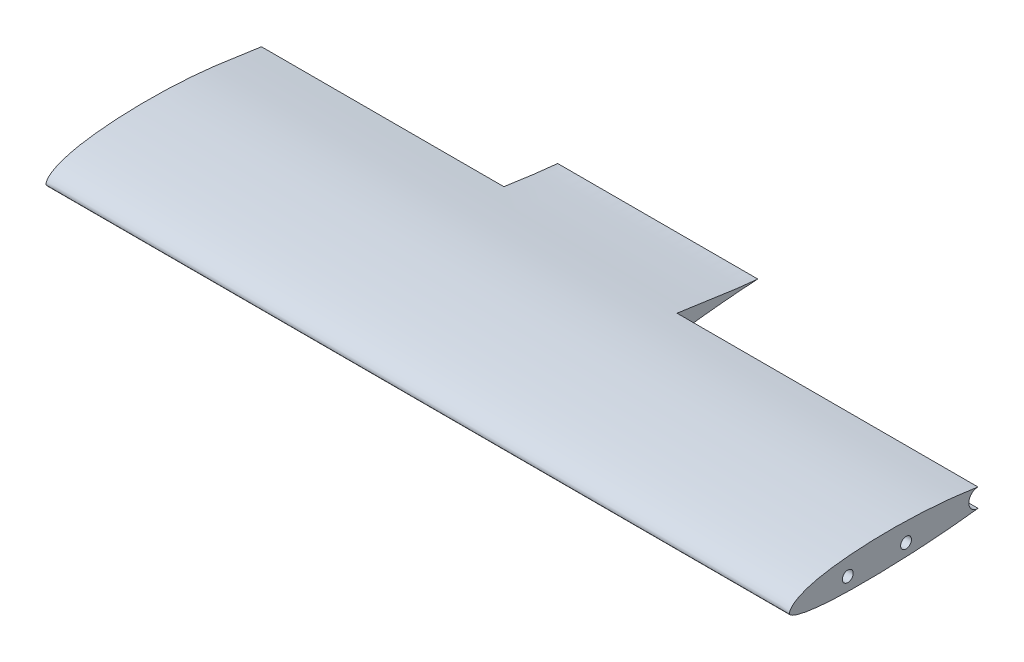
ISO-10303-21;
HEADER;
FILE_DESCRIPTION(('STEP AP214'),'2;1');
FILE_NAME('part.step','',(''),(''),'','','');
FILE_SCHEMA(('AUTOMOTIVE_DESIGN { 1 0 10303 214 1 1 1 1 }'));
ENDSEC;
DATA;
#1=APPLICATION_CONTEXT('core data for automotive mechanical design processes');
#2=APPLICATION_PROTOCOL_DEFINITION('international standard','automotive_design',2000,#1);
#3=PRODUCT_CONTEXT('',#1,'mechanical');
#4=PRODUCT('Part','Part','',(#3));
#5=PRODUCT_RELATED_PRODUCT_CATEGORY('part','',(#4));
#6=PRODUCT_DEFINITION_FORMATION('','',#4);
#7=PRODUCT_DEFINITION_CONTEXT('part definition',#1,'design');
#8=PRODUCT_DEFINITION('design','',#6,#7);
#9=PRODUCT_DEFINITION_SHAPE('','',#8);
#10=(LENGTH_UNIT() NAMED_UNIT(*) SI_UNIT(.MILLI.,.METRE.));
#11=(NAMED_UNIT(*) PLANE_ANGLE_UNIT() SI_UNIT($,.RADIAN.));
#12=(NAMED_UNIT(*) SI_UNIT($,.STERADIAN.) SOLID_ANGLE_UNIT());
#13=UNCERTAINTY_MEASURE_WITH_UNIT(LENGTH_MEASURE(1.E-05),#10,'distance_accuracy_value','');
#14=(GEOMETRIC_REPRESENTATION_CONTEXT(3) GLOBAL_UNCERTAINTY_ASSIGNED_CONTEXT((#13)) GLOBAL_UNIT_ASSIGNED_CONTEXT((#10,
#11,#12)) REPRESENTATION_CONTEXT('',''));
#15=CARTESIAN_POINT('',(0.,0.,0.));
#16=DIRECTION('',(0.,0.,1.));
#17=DIRECTION('',(1.,0.,0.));
#18=AXIS2_PLACEMENT_3D('',#15,#16,#17);
#19=CARTESIAN_POINT('',(1040.,4.83997638769715,-346.6));
#20=CARTESIAN_POINT('',(1040.,4.84868294691011,-346.59785213397));
#21=CARTESIAN_POINT('',(1040.,4.93336209756162,-345.166936044504));
#22=CARTESIAN_POINT('',(1040.,5.10700694519278,-343.709836643677));
#23=CARTESIAN_POINT('',(1040.,5.41017075794042,-340.206784132033));
#24=CARTESIAN_POINT('',(1040.,5.85268281466644,-335.905943355972));
#25=CARTESIAN_POINT('',(1040.,6.4722745474185,-330.29031907157));
#26=CARTESIAN_POINT('',(1040.,7.25373437050042,-323.655847310548));
#27=CARTESIAN_POINT('',(1040.,8.22307664941785,-315.997567636551));
#28=CARTESIAN_POINT('',(1040.,9.36156097861068,-307.423222857254));
#29=CARTESIAN_POINT('',(1040.,10.6635037599335,-298.010831034326));
#30=CARTESIAN_POINT('',(1040.,12.1173159709685,-287.854212759161));
#31=CARTESIAN_POINT('',(1040.,13.6988944275419,-277.048408585074));
#32=CARTESIAN_POINT('',(1040.,15.3817883153086,-265.691695949232));
#33=CARTESIAN_POINT('',(1040.,17.1219228948068,-253.881119893573));
#34=CARTESIAN_POINT('',(1040.,18.9007690967919,-241.720308010265));
#35=CARTESIAN_POINT('',(1040.,20.638143833598,-229.308493852932));
#36=CARTESIAN_POINT('',(1040.,22.3157910551663,-216.741551687001));
#37=CARTESIAN_POINT('',(1040.,23.7595433863055,-204.050857632811));
#38=CARTESIAN_POINT('',(1040.,24.9053426433323,-191.257428920763));
#39=CARTESIAN_POINT('',(1040.,25.8572517006955,-178.398255103325));
#40=CARTESIAN_POINT('',(1040.,26.5782085447624,-165.519761570319));
#41=CARTESIAN_POINT('',(1040.,27.0713380866151,-152.694536507981));
#42=CARTESIAN_POINT('',(1040.,27.3617048782736,-139.989981786491));
#43=CARTESIAN_POINT('',(1040.,27.4214259489243,-127.474648660722));
#44=CARTESIAN_POINT('',(1040.,27.2786662067202,-115.21693666225));
#45=CARTESIAN_POINT('',(1040.,26.9174034340255,-103.283909878835));
#46=CARTESIAN_POINT('',(1040.,26.360201212197,-91.7466650302918));
#47=CARTESIAN_POINT('',(1040.,25.602562122874,-80.6691840019192));
#48=CARTESIAN_POINT('',(1040.,24.6662261613144,-70.1181532773865));
#49=CARTESIAN_POINT('',(1040.,23.5415922869784,-60.1571368746462));
#50=CARTESIAN_POINT('',(1040.,22.2483852151924,-50.843546419187));
#51=CARTESIAN_POINT('',(1040.,20.7681558316871,-42.2316784452521));
#52=CARTESIAN_POINT('',(1040.,19.1388977835948,-34.3615830461008));
#53=CARTESIAN_POINT('',(1040.,17.3170359072766,-27.2684076187504));
#54=CARTESIAN_POINT('',(1040.,15.3019620529912,-20.9780333205586));
#55=CARTESIAN_POINT('',(1040.,13.1824606631904,-15.4779938036206));
#56=CARTESIAN_POINT('',(1040.,10.9371691606662,-10.7994149202204));
#57=CARTESIAN_POINT('',(1040.,8.63337766346878,-6.95382679368364));
#58=CARTESIAN_POINT('',(1040.,6.30098718992494,-3.93591898079676));
#59=CARTESIAN_POINT('',(1040.,3.89645227401003,-1.76621965553461));
#60=CARTESIAN_POINT('',(1040.,1.5610546807599,-0.467529411694256));
#61=CARTESIAN_POINT('',(1040.,-0.611861653624535,0.289663119257988));
#62=CARTESIAN_POINT('',(1040.,-2.77906348855156,-0.370650439303011));
#63=CARTESIAN_POINT('',(1040.,-4.21995184765395,-2.48232441391583));
#64=CARTESIAN_POINT('',(1040.,-5.67727699514903,-5.33698465791971));
#65=CARTESIAN_POINT('',(1040.,-7.07739123288437,-9.25198377943141));
#66=CARTESIAN_POINT('',(1040.,-8.39823430199488,-14.1065752398985));
#67=CARTESIAN_POINT('',(1040.,-9.61516954449393,-19.9024318244629));
#68=CARTESIAN_POINT('',(1040.,-10.7010995656754,-26.599345669982));
#69=CARTESIAN_POINT('',(1040.,-11.6537912755739,-34.1645195713889));
#70=CARTESIAN_POINT('',(1040.,-12.4597704216329,-42.5604388567903));
#71=CARTESIAN_POINT('',(1040.,-13.1153519549816,-51.7390191835686));
#72=CARTESIAN_POINT('',(1040.,-13.6251626516985,-61.6504552794448));
#73=CARTESIAN_POINT('',(1040.,-13.9816658713143,-72.2364850835678));
#74=CARTESIAN_POINT('',(1040.,-14.1886964665776,-83.4369290290459));
#75=CARTESIAN_POINT('',(1040.,-14.2450062649441,-95.1838047668361));
#76=CARTESIAN_POINT('',(1040.,-14.156607094396,-107.40667693573));
#77=CARTESIAN_POINT('',(1040.,-13.9277138872244,-120.030586221615));
#78=CARTESIAN_POINT('',(1040.,-13.5623258304755,-132.975867445929));
#79=CARTESIAN_POINT('',(1040.,-13.0683037139574,-146.159637367673));
#80=CARTESIAN_POINT('',(1040.,-12.4378717594453,-159.496107279272));
#81=CARTESIAN_POINT('',(1040.,-11.6818130666688,-172.896412867546));
#82=CARTESIAN_POINT('',(1040.,-10.7518834607499,-186.290828968544));
#83=CARTESIAN_POINT('',(1040.,-9.61892352332749,-199.629097752344));
#84=CARTESIAN_POINT('',(1040.,-8.33578917286104,-212.876622586146));
#85=CARTESIAN_POINT('',(1040.,-6.93958504172576,-225.984173770363));
#86=CARTESIAN_POINT('',(1040.,-5.47533275442785,-238.880374036266));
#87=CARTESIAN_POINT('',(1040.,-4.00845717439935,-251.491480033317));
#88=CARTESIAN_POINT('',(1040.,-2.58431265111658,-263.721696697937));
#89=CARTESIAN_POINT('',(1040.,-1.25971224140681,-275.470578158299));
#90=CARTESIAN_POINT('',(1040.,-0.0540326872204289,-286.627453872095));
#91=CARTESIAN_POINT('',(1040.,1.01236984619496,-297.086149346924));
#92=CARTESIAN_POINT('',(1040.,1.92639151980839,-306.747444526378));
#93=CARTESIAN_POINT('',(1040.,2.68985457896187,-315.513180102047));
#94=CARTESIAN_POINT('',(1040.,3.31662469525845,-323.304392995755));
#95=CARTESIAN_POINT('',(1040.,3.80488062569906,-330.019051028372));
#96=CARTESIAN_POINT('',(1040.,4.19871820912005,-335.688272924819));
#97=CARTESIAN_POINT('',(1040.,4.53103604311106,-340.041103550893));
#98=CARTESIAN_POINT('',(1040.,4.7368187688383,-343.623424741997));
#99=CARTESIAN_POINT('',(1040.,4.84931723782861,-345.114805989598));
#100=CARTESIAN_POINT('',(1040.,4.8310854484679,-346.602193351688));
#101=CARTESIAN_POINT('',(1040.,4.83997638769715,-346.6));
#102=B_SPLINE_CURVE_WITH_KNOTS('',3,(#19,#20,#21,#22,#23,#24,#25,#26,#27,#28,#29,#30,#31,#32,
#33,#34,#35,#36,#37,#38,#39,#40,#41,#42,#43,#44,#45,#46,#47,#48,#49,#50,#51,#52,#53,#54,#55,#56,
#57,#58,#59,#60,#61,#62,#63,#64,#65,#66,#67,#68,#69,#70,#71,#72,#73,#74,#75,#76,#77,#78,#79,#80,
#81,#82,#83,#84,#85,#86,#87,#88,#89,#90,#91,#92,#93,#94,#95,#96,#97,#98,#99,#100,#101),
.UNSPECIFIED.,.T.,.F.,(4,1,1,1,1,1,1,1,1,1,1,1,1,1,1,1,1,1,1,1,1,1,1,1,1,1,1,1,1,1,1,1,1,1,1,1,
1,1,1,1,1,1,1,1,1,1,1,1,1,1,1,1,1,1,1,1,1,1,1,1,1,1,1,1,1,1,1,1,1,1,1,1,1,1,1,1,1,1,1,1,4),(0.,
0.000971237958935089,0.00379550488941406,0.00838889713311412,0.0147108585341679,
0.0226780451151255,0.0321935893654122,0.0431578374772158,0.0554477635765267,0.0689450810748732,
0.0835209743295518,0.0990345049396833,0.115338149300278,0.132292378261073,0.149748787287016,
0.167548160817062,0.185533000847794,0.203606824322396,0.221802152219981,0.240094780419079,
0.258381325545334,0.276593840485898,0.294615696320151,0.312363136598153,0.329758285552068,
0.34668867666744,0.363076304230722,0.378823915995178,0.393853850968574,0.408070676422894,
0.421404123740081,0.433792847882556,0.445184773052429,0.455537591190034,0.464887425285465,
0.473229998593558,0.480557633281548,0.486906623799577,0.492238034051424,0.496718364977629,
0.500526341599145,0.503606091199367,0.506177592628953,0.509478573363382,0.514052138731787,
0.519911011985978,0.527046393100711,0.535434514860353,0.545049400456516,0.555862282514593,
0.56781964692456,0.58087606000333,0.594950040868561,0.609977749598367,0.625870112949949,
0.642537246695213,0.659878939874303,0.677794441934522,0.696172799529494,0.714892973853184,
0.733838964579521,0.752890035469179,0.771908418749841,0.790874705845988,0.809754599599678,
0.828447710464764,0.846871330730811,0.864890849052298,0.882382263972322,0.89917761398861,
0.915117479075331,0.930053399369896,0.943838005379903,0.956340240690094,0.967439356026097,
0.977019226998307,0.985009700423928,0.991382470548144,0.996091139759218,0.999008193999625,1.),.UNSPECIFIED.);
#103=DIRECTION('',(-1.,0.,0.));
#104=VECTOR('',#103,1.);
#105=SURFACE_OF_LINEAR_EXTRUSION('',#102,#104);
#106=CARTESIAN_POINT('',(-470.4,18.7617372690907,-242.6));
#107=CARTESIAN_POINT('',(-470.4,18.4861754169665,-244.519503118179));
#108=CARTESIAN_POINT('',(-470.4,18.2080068766833,-246.438627718452));
#109=CARTESIAN_POINT('',(-470.4,17.648596991396,-250.276433454266));
#110=CARTESIAN_POINT('',(-470.4,17.3673556403513,-252.195114588928));
#111=CARTESIAN_POINT('',(-470.4,16.8039420848592,-256.032337516827));
#112=CARTESIAN_POINT('',(-470.4,16.5217698813349,-257.950879310199));
#113=CARTESIAN_POINT('',(-470.4,15.956553905387,-261.787832596597));
#114=CARTESIAN_POINT('',(-470.4,15.6735101339023,-263.70624408976));
#115=CARTESIAN_POINT('',(-470.4,15.1066113626237,-267.542946852838));
#116=CARTESIAN_POINT('',(-470.4,14.8227563629235,-269.461238122766));
#117=CARTESIAN_POINT('',(-470.4,14.2554931900897,-273.297889204433));
#118=CARTESIAN_POINT('',(-470.4,13.9720850174958,-275.216249016253));
#119=CARTESIAN_POINT('',(-470.4,13.4070236766433,-279.0532302451));
#120=CARTESIAN_POINT('',(-470.4,13.1253705109116,-280.9718516625));
#121=CARTESIAN_POINT('',(-470.4,12.5646409947528,-284.809463002019));
#122=CARTESIAN_POINT('',(-470.4,12.28556463337,-286.728452922536));
#123=CARTESIAN_POINT('',(-470.4,11.7308268937594,-290.566920890903));
#124=CARTESIAN_POINT('',(-470.4,11.4551655050206,-292.486398937231));
#125=CARTESIAN_POINT('',(-470.4,10.90842201053,-296.326048849765));
#126=CARTESIAN_POINT('',(-470.4,10.6373400002637,-298.246220729586));
#127=CARTESIAN_POINT('',(-470.4,10.1008000727563,-302.087337642931));
#128=CARTESIAN_POINT('',(-470.4,9.83534211744316,-304.00828267113));
#129=CARTESIAN_POINT('',(-470.4,9.31086706888201,-307.850882309116));
#130=CARTESIAN_POINT('',(-470.4,9.05184941609702,-309.772536842436));
#131=CARTESIAN_POINT('',(-470.4,8.54112247659432,-313.617221031497));
#132=CARTESIAN_POINT('',(-470.4,8.28941470880274,-315.540250889156));
#133=CARTESIAN_POINT('',(-470.4,7.79483429429874,-319.387285958403));
#134=CARTESIAN_POINT('',(-470.4,7.55196089855657,-321.311291073211));
#135=CARTESIAN_POINT('',(-470.4,7.07958752750583,-325.159491374509));
#136=CARTESIAN_POINT('',(-470.4,6.8500777010983,-327.083685346183));
#137=CARTESIAN_POINT('',(-470.4,6.51544027130188,-329.974631467041));
#138=CARTESIAN_POINT('',(-470.4,6.40530863459935,-330.940807368128));
#139=CARTESIAN_POINT('',(-470.4,6.18869979990306,-332.872467920463));
#140=CARTESIAN_POINT('',(-470.4,6.08221862691694,-333.837952125187));
#141=CARTESIAN_POINT('',(-470.4,5.87395074932842,-335.757575106809));
#142=CARTESIAN_POINT('',(-470.4,5.77212276224222,-336.711709411678));
#143=CARTESIAN_POINT('',(-470.4,5.57354362518302,-338.635776634387));
#144=CARTESIAN_POINT('',(-470.4,5.47689824353089,-339.605720748241));
#145=CARTESIAN_POINT('',(-470.4,5.3391649176087,-341.079890314043));
#146=CARTESIAN_POINT('',(-470.4,5.29371455941509,-341.583709942369));
#147=CARTESIAN_POINT('',(-470.4,5.2253657201099,-342.33290160343));
#148=CARTESIAN_POINT('',(-470.4,5.20285534236857,-342.578309502865));
#149=CARTESIAN_POINT('',(-470.4,5.15815293241496,-343.056282380408));
#150=CARTESIAN_POINT('',(-470.4,5.13600523407568,-343.28885148347));
#151=CARTESIAN_POINT('',(-470.4,5.10230592286108,-343.630833723333));
#152=CARTESIAN_POINT('',(-470.4,5.09134786647534,-343.740303926589));
#153=CARTESIAN_POINT('',(-470.4,5.06937916918066,-343.954110375556));
#154=CARTESIAN_POINT('',(-470.4,5.05839449848972,-344.058449442848));
#155=CARTESIAN_POINT('',(-470.4,5.02507891106534,-344.374289321747));
#156=CARTESIAN_POINT('',(-470.4,5.00268075443683,-344.585800542476));
#157=CARTESIAN_POINT('',(-470.4,4.95751067685402,-345.054041819377));
#158=CARTESIAN_POINT('',(-470.4,4.93566922032998,-345.310837282722));
#159=CARTESIAN_POINT('',(-470.4,4.90431589552413,-345.728774337157));
#160=CARTESIAN_POINT('',(-470.4,4.89325363382162,-345.889632507738));
#161=CARTESIAN_POINT('',(-470.4,4.87734873352296,-346.132017878093));
#162=CARTESIAN_POINT('',(-470.4,4.87210805990084,-346.213904872774));
#163=CARTESIAN_POINT('',(-470.4,4.86200293562986,-346.362602818064));
#164=CARTESIAN_POINT('',(-470.4,4.8572729831726,-346.429152306949));
#165=CARTESIAN_POINT('',(-470.4,4.85073378673656,-346.515110102969));
#166=CARTESIAN_POINT('',(-470.4,4.84908058449731,-346.536356279718));
#167=CARTESIAN_POINT('',(-470.4,4.84571502121069,-346.566877765028));
#168=CARTESIAN_POINT('',(-470.4,4.84476995328596,-346.574740704312));
#169=CARTESIAN_POINT('',(-470.4,4.84360328283555,-346.585278608424));
#170=CARTESIAN_POINT('',(-470.4,4.84324346607914,-346.588798650202));
#171=CARTESIAN_POINT('',(-470.4,4.84131368702679,-346.597403069394));
#172=CARTESIAN_POINT('',(-470.4,4.84063368741576,-346.600159588684));
#173=CARTESIAN_POINT('',(-470.4,4.83935414418299,-346.599870023558));
#174=CARTESIAN_POINT('',(-470.4,4.83875514363562,-346.597504767629));
#175=CARTESIAN_POINT('',(-470.4,4.83795286932072,-346.593353962315));
#176=CARTESIAN_POINT('',(-470.4,4.83785524258958,-346.591785083274));
#177=CARTESIAN_POINT('',(-470.4,4.8375568317182,-346.587680464041));
#178=CARTESIAN_POINT('',(-470.4,4.83733102942984,-346.585003225258));
#179=CARTESIAN_POINT('',(-470.4,4.83661853034434,-346.57503571298));
#180=CARTESIAN_POINT('',(-470.4,4.83638244571469,-346.568012928622));
#181=CARTESIAN_POINT('',(-470.4,4.83555483401321,-346.539683723223));
#182=CARTESIAN_POINT('',(-470.4,4.83520190821233,-346.518021972725));
#183=CARTESIAN_POINT('',(-470.4,4.83465480472562,-346.46679218753));
#184=CARTESIAN_POINT('',(-470.4,4.83456952308799,-346.437300272486));
#185=CARTESIAN_POINT('',(-470.4,4.83447099901124,-346.332162665243));
#186=CARTESIAN_POINT('',(-470.4,4.83477836541123,-346.256381765431));
#187=CARTESIAN_POINT('',(-470.4,4.83569453649187,-346.013593838664));
#188=CARTESIAN_POINT('',(-470.4,4.8362202889023,-345.846691282305));
#189=CARTESIAN_POINT('',(-470.4,4.83446792964323,-345.53474119572));
#190=CARTESIAN_POINT('',(-470.4,4.83254890713136,-345.389701495159));
#191=CARTESIAN_POINT('',(-470.4,4.82394057947381,-345.006916045306));
#192=CARTESIAN_POINT('',(-470.4,4.8149849405098,-344.769221980985));
#193=CARTESIAN_POINT('',(-470.4,4.79092869998618,-344.323971432122));
#194=CARTESIAN_POINT('',(-470.4,4.77673642599831,-344.116362682054));
#195=CARTESIAN_POINT('',(-470.4,4.73256053505299,-343.452996786862));
#196=CARTESIAN_POINT('',(-470.4,4.70397241795561,-342.997162295789));
#197=CARTESIAN_POINT('',(-470.4,4.64497789584562,-342.040241658746));
#198=CARTESIAN_POINT('',(-470.4,4.61467212622049,-341.539148549351));
#199=CARTESIAN_POINT('',(-470.4,4.55144912208158,-340.538542181052));
#200=CARTESIAN_POINT('',(-470.4,4.5185394758181,-340.03902844423));
#201=CARTESIAN_POINT('',(-470.4,4.45081853390116,-339.055240296658));
#202=CARTESIAN_POINT('',(-470.4,4.41609432315049,-338.570959856617));
#203=CARTESIAN_POINT('',(-470.4,4.34596382635258,-337.609517110971));
#204=CARTESIAN_POINT('',(-470.4,4.31057475831044,-337.132353523787));
#205=CARTESIAN_POINT('',(-470.4,4.24017032806792,-336.176951562364));
#206=CARTESIAN_POINT('',(-470.4,4.20515594972367,-335.698713114658));
#207=CARTESIAN_POINT('',(-470.4,4.10061438881018,-334.253545301598));
#208=CARTESIAN_POINT('',(-470.4,4.03237472487136,-333.286523268296));
#209=CARTESIAN_POINT('',(-470.4,3.89569674776987,-331.348834221473));
#210=CARTESIAN_POINT('',(-470.4,3.82725865428189,-330.378167195546));
#211=CARTESIAN_POINT('',(-470.4,3.68877831499041,-328.440200694262));
#212=CARTESIAN_POINT('',(-470.4,3.61874218090938,-327.472900785142));
#213=CARTESIAN_POINT('',(-470.4,3.47646395870035,-325.539828452356));
#214=CARTESIAN_POINT('',(-470.4,3.40422510612418,-324.574055791023));
#215=CARTESIAN_POINT('',(-470.4,3.18288444790925,-321.675049235186));
#216=CARTESIAN_POINT('',(-470.4,3.02930091814534,-319.742156556811));
#217=CARTESIAN_POINT('',(-470.4,2.71267491748936,-315.876577078051));
#218=CARTESIAN_POINT('',(-470.4,2.54962966984344,-313.943890506573));
#219=CARTESIAN_POINT('',(-470.4,2.21472436413439,-310.079802906909));
#220=CARTESIAN_POINT('',(-470.4,2.04286668323386,-308.148401672925));
#221=CARTESIAN_POINT('',(-470.4,1.69014543718608,-304.286272803568));
#222=CARTESIAN_POINT('',(-470.4,1.50928118213236,-302.355545231241));
#223=CARTESIAN_POINT('',(-470.4,1.13916665603011,-298.494845943157));
#224=CARTESIAN_POINT('',(-470.4,0.949916173595348,-296.564874247693));
#225=CARTESIAN_POINT('',(-470.4,0.563788390131057,-292.705742444512));
#226=CARTESIAN_POINT('',(-470.4,0.366911274099315,-290.776582318256));
#227=CARTESIAN_POINT('',(-470.4,-0.0333816643499205,-286.918944018225));
#228=CARTESIAN_POINT('',(-470.4,-0.236797479228031,-284.990465843668));
#229=CARTESIAN_POINT('',(-470.4,-0.649255837639434,-281.134100900233));
#230=CARTESIAN_POINT('',(-470.4,-0.858298413683997,-279.206214134838));
#231=CARTESIAN_POINT('',(-470.4,-1.28109301583489,-275.350958580982));
#232=CARTESIAN_POINT('',(-470.4,-1.49484504001057,-273.423589792309));
#233=CARTESIAN_POINT('',(-470.4,-1.92640083393849,-269.569309637798));
#234=CARTESIAN_POINT('',(-470.4,-2.14420459647336,-267.642398271152));
#235=CARTESIAN_POINT('',(-470.4,-2.58345759592163,-263.788992410155));
#236=CARTESIAN_POINT('',(-470.4,-2.80490683127546,-261.862497915626));
#237=CARTESIAN_POINT('',(-470.4,-3.25013856537292,-258.009778223252));
#238=CARTESIAN_POINT('',(-470.4,-3.47392106538957,-256.083553025554));
#239=CARTESIAN_POINT('',(-470.4,-3.92201749471503,-252.231164479462));
#240=CARTESIAN_POINT('',(-470.4,-4.14633142404381,-250.30500113107));
#241=CARTESIAN_POINT('',(-470.4,-4.59427289605636,-246.452595417754));
#242=CARTESIAN_POINT('',(-470.4,-4.81790043899336,-244.526353052859));
#243=CARTESIAN_POINT('',(-470.4,-5.04057596839266,-242.599999999999));
#244=B_SPLINE_CURVE_WITH_KNOTS('',3,(#106,#107,#108,#109,#110,#111,#112,#113,#114,#115,#116,
#117,#118,#119,#120,#121,#122,#123,#124,#125,#126,#127,#128,#129,#130,#131,#132,#133,#134,#135,
#136,#137,#138,#139,#140,#141,#142,#143,#144,#145,#146,#147,#148,#149,#150,#151,#152,#153,#154,
#155,#156,#157,#158,#159,#160,#161,#162,#163,#164,#165,#166,#167,#168,#169,#170,#171,#172,#173,
#174,#175,#176,#177,#178,#179,#180,#181,#182,#183,#184,#185,#186,#187,#188,#189,#190,#191,#192,
#193,#194,#195,#196,#197,#198,#199,#200,#201,#202,#203,#204,#205,#206,#207,#208,#209,#210,#211,
#212,#213,#214,#215,#216,#217,#218,#219,#220,#221,#222,#223,#224,#225,#226,#227,#228,#229,#230,
#231,#232,#233,#234,#235,#236,#237,#238,#239,#240,#241,#242,#243),.UNSPECIFIED.,.F.,.F.,(4,2,2,
2,2,2,2,2,2,2,2,2,2,2,2,2,2,2,2,2,2,2,2,2,2,2,2,2,2,2,2,2,2,2,2,2,2,2,2,2,2,2,2,2,2,2,2,2,2,2,2,
2,2,2,2,2,2,2,2,2,2,2,2,2,2,2,2,2,4),(0.,5.81753820186367,11.6350878417829,17.4526317138667,
23.270169321638,29.0877062577664,34.9052502158169,40.7228025482884,46.5403301352425,
52.3578398117371,58.1754706407388,63.9930620747311,69.8101462945402,75.6284307251266,
81.4462206921644,87.2596662549146,90.1769587154228,93.0909665378748,95.9696193119261,
98.893801280128,100.411393787687,101.150707769273,101.851570195296,102.181618985453,
102.496372644465,103.134364393417,103.90782279239,104.390901483986,104.637950081074,
104.835572323973,104.901389250446,104.923529392715,104.937549499887,104.94286564018,
104.947518745607,104.953121017421,104.960835989585,104.982277534742,105.046788942036,
105.1354517812,105.362608521139,105.863479670815,106.298585384019,107.012043052341,
107.636295077707,109.006501848391,110.512520767559,112.01430196118,113.47086840722,
114.906291236616,116.344845990729,119.253123987275,122.172354200598,125.081847802769,
127.987256069042,133.804176816883,139.622813389827,145.439888553179,151.257409993849,
157.075078156532,162.892605289407,168.71012571468,174.527679760644,180.345231421745,
186.162772721049,191.980311531632,197.797853516377,203.615395719638,209.432935776403),.UNSPECIFIED.);
#245=CARTESIAN_POINT('',(-470.4,-5.04057596839264,-242.599999999999));
#246=VERTEX_POINT('',#245);
#247=CARTESIAN_POINT('',(-470.4,18.7617372690907,-242.6));
#248=VERTEX_POINT('',#247);
#249=EDGE_CURVE('E129',#246,#248,#244,.F.);
#250=ORIENTED_EDGE('',*,*,#249,.F.);
#251=DIRECTION('',(1.,0.,0.));
#252=VECTOR('',#251,1.);
#253=CARTESIAN_POINT('',(-470.4,-5.04057596839264,-242.599999999999));
#254=LINE('',#253,#252);
#255=CARTESIAN_POINT('',(-83.,-5.04057596839264,-242.599999999999));
#256=VERTEX_POINT('',#255);
#257=EDGE_CURVE('E134',#246,#256,#254,.T.);
#258=ORIENTED_EDGE('',*,*,#257,.T.);
#259=CARTESIAN_POINT('',(-83.,4.83997638769715,-346.6));
#260=CARTESIAN_POINT('',(-83.,4.84868294691011,-346.59785213397));
#261=CARTESIAN_POINT('',(-83.,4.93336209756162,-345.166936044504));
#262=CARTESIAN_POINT('',(-83.,5.10700694519278,-343.709836643677));
#263=CARTESIAN_POINT('',(-83.,5.41017075794042,-340.206784132033));
#264=CARTESIAN_POINT('',(-83.,5.85268281466644,-335.905943355972));
#265=CARTESIAN_POINT('',(-83.,6.4722745474185,-330.29031907157));
#266=CARTESIAN_POINT('',(-83.,7.25373437050042,-323.655847310548));
#267=CARTESIAN_POINT('',(-83.,8.22307664941785,-315.997567636551));
#268=CARTESIAN_POINT('',(-83.,9.36156097861068,-307.423222857254));
#269=CARTESIAN_POINT('',(-83.,10.6635037599335,-298.010831034326));
#270=CARTESIAN_POINT('',(-83.,12.1173159709685,-287.854212759161));
#271=CARTESIAN_POINT('',(-83.,13.6988944275419,-277.048408585074));
#272=CARTESIAN_POINT('',(-83.,15.3817883153086,-265.691695949232));
#273=CARTESIAN_POINT('',(-83.,17.1219228948068,-253.881119893573));
#274=CARTESIAN_POINT('',(-83.,18.9007690967919,-241.720308010265));
#275=CARTESIAN_POINT('',(-83.,20.638143833598,-229.308493852932));
#276=CARTESIAN_POINT('',(-83.,22.3157910551663,-216.741551687001));
#277=CARTESIAN_POINT('',(-83.,23.7595433863055,-204.050857632811));
#278=CARTESIAN_POINT('',(-83.,24.9053426433323,-191.257428920763));
#279=CARTESIAN_POINT('',(-83.,25.8572517006955,-178.398255103325));
#280=CARTESIAN_POINT('',(-83.,26.5782085447624,-165.519761570319));
#281=CARTESIAN_POINT('',(-83.,27.0713380866151,-152.694536507981));
#282=CARTESIAN_POINT('',(-83.,27.3617048782736,-139.989981786491));
#283=CARTESIAN_POINT('',(-83.,27.4214259489243,-127.474648660722));
#284=CARTESIAN_POINT('',(-83.,27.2786662067202,-115.21693666225));
#285=CARTESIAN_POINT('',(-83.,26.9174034340255,-103.283909878835));
#286=CARTESIAN_POINT('',(-83.,26.360201212197,-91.7466650302918));
#287=CARTESIAN_POINT('',(-83.,25.602562122874,-80.6691840019192));
#288=CARTESIAN_POINT('',(-83.,24.6662261613144,-70.1181532773865));
#289=CARTESIAN_POINT('',(-83.,23.5415922869784,-60.1571368746462));
#290=CARTESIAN_POINT('',(-83.,22.2483852151924,-50.843546419187));
#291=CARTESIAN_POINT('',(-83.,20.7681558316871,-42.2316784452521));
#292=CARTESIAN_POINT('',(-83.,19.1388977835948,-34.3615830461008));
#293=CARTESIAN_POINT('',(-83.,17.3170359072766,-27.2684076187504));
#294=CARTESIAN_POINT('',(-83.,15.3019620529912,-20.9780333205586));
#295=CARTESIAN_POINT('',(-83.,13.1824606631904,-15.4779938036206));
#296=CARTESIAN_POINT('',(-83.,10.9371691606662,-10.7994149202204));
#297=CARTESIAN_POINT('',(-83.,8.63337766346878,-6.95382679368364));
#298=CARTESIAN_POINT('',(-83.,6.30098718992494,-3.93591898079676));
#299=CARTESIAN_POINT('',(-83.,3.89645227401003,-1.76621965553461));
#300=CARTESIAN_POINT('',(-83.,1.5610546807599,-0.467529411694256));
#301=CARTESIAN_POINT('',(-83.,-0.611861653624535,0.289663119257988));
#302=CARTESIAN_POINT('',(-83.,-2.77906348855156,-0.370650439303011));
#303=CARTESIAN_POINT('',(-83.,-4.21995184765395,-2.48232441391583));
#304=CARTESIAN_POINT('',(-83.,-5.67727699514903,-5.33698465791971));
#305=CARTESIAN_POINT('',(-83.,-7.07739123288437,-9.25198377943141));
#306=CARTESIAN_POINT('',(-83.,-8.39823430199488,-14.1065752398985));
#307=CARTESIAN_POINT('',(-83.,-9.61516954449393,-19.9024318244629));
#308=CARTESIAN_POINT('',(-83.,-10.7010995656754,-26.599345669982));
#309=CARTESIAN_POINT('',(-83.,-11.6537912755739,-34.1645195713889));
#310=CARTESIAN_POINT('',(-83.,-12.4597704216329,-42.5604388567903));
#311=CARTESIAN_POINT('',(-83.,-13.1153519549816,-51.7390191835686));
#312=CARTESIAN_POINT('',(-83.,-13.6251626516985,-61.6504552794448));
#313=CARTESIAN_POINT('',(-83.,-13.9816658713143,-72.2364850835678));
#314=CARTESIAN_POINT('',(-83.,-14.1886964665776,-83.4369290290459));
#315=CARTESIAN_POINT('',(-83.,-14.2450062649441,-95.1838047668361));
#316=CARTESIAN_POINT('',(-83.,-14.156607094396,-107.40667693573));
#317=CARTESIAN_POINT('',(-83.,-13.9277138872244,-120.030586221615));
#318=CARTESIAN_POINT('',(-83.,-13.5623258304755,-132.975867445929));
#319=CARTESIAN_POINT('',(-83.,-13.0683037139574,-146.159637367673));
#320=CARTESIAN_POINT('',(-83.,-12.4378717594453,-159.496107279272));
#321=CARTESIAN_POINT('',(-83.,-11.6818130666688,-172.896412867546));
#322=CARTESIAN_POINT('',(-83.,-10.7518834607499,-186.290828968544));
#323=CARTESIAN_POINT('',(-83.,-9.61892352332749,-199.629097752344));
#324=CARTESIAN_POINT('',(-83.,-8.33578917286104,-212.876622586146));
#325=CARTESIAN_POINT('',(-83.,-6.93958504172576,-225.984173770363));
#326=CARTESIAN_POINT('',(-83.,-5.47533275442785,-238.880374036266));
#327=CARTESIAN_POINT('',(-83.,-4.00845717439935,-251.491480033317));
#328=CARTESIAN_POINT('',(-83.,-2.58431265111658,-263.721696697937));
#329=CARTESIAN_POINT('',(-83.,-1.25971224140681,-275.470578158299));
#330=CARTESIAN_POINT('',(-83.,-0.0540326872204289,-286.627453872095));
#331=CARTESIAN_POINT('',(-83.,1.01236984619496,-297.086149346924));
#332=CARTESIAN_POINT('',(-83.,1.92639151980839,-306.747444526378));
#333=CARTESIAN_POINT('',(-83.,2.68985457896187,-315.513180102047));
#334=CARTESIAN_POINT('',(-83.,3.31662469525845,-323.304392995755));
#335=CARTESIAN_POINT('',(-83.,3.80488062569906,-330.019051028372));
#336=CARTESIAN_POINT('',(-83.,4.19871820912005,-335.688272924819));
#337=CARTESIAN_POINT('',(-83.,4.53103604311106,-340.041103550893));
#338=CARTESIAN_POINT('',(-83.,4.7368187688383,-343.623424741997));
#339=CARTESIAN_POINT('',(-83.,4.84931723782861,-345.114805989598));
#340=CARTESIAN_POINT('',(-83.,4.8310854484679,-346.602193351688));
#341=CARTESIAN_POINT('',(-83.,4.83997638769715,-346.6));
#342=B_SPLINE_CURVE_WITH_KNOTS('',3,(#259,#260,#261,#262,#263,#264,#265,#266,#267,#268,#269,
#270,#271,#272,#273,#274,#275,#276,#277,#278,#279,#280,#281,#282,#283,#284,#285,#286,#287,#288,
#289,#290,#291,#292,#293,#294,#295,#296,#297,#298,#299,#300,#301,#302,#303,#304,#305,#306,#307,
#308,#309,#310,#311,#312,#313,#314,#315,#316,#317,#318,#319,#320,#321,#322,#323,#324,#325,#326,
#327,#328,#329,#330,#331,#332,#333,#334,#335,#336,#337,#338,#339,#340,#341),.UNSPECIFIED.,.T.,
.F.,(4,1,1,1,1,1,1,1,1,1,1,1,1,1,1,1,1,1,1,1,1,1,1,1,1,1,1,1,1,1,1,1,1,1,1,1,1,1,1,1,1,1,1,1,1,
1,1,1,1,1,1,1,1,1,1,1,1,1,1,1,1,1,1,1,1,1,1,1,1,1,1,1,1,1,1,1,1,1,1,1,4),(0.,
0.000971237958935089,0.00379550488941406,0.00838889713311412,0.0147108585341679,
0.0226780451151255,0.0321935893654122,0.0431578374772158,0.0554477635765267,0.0689450810748732,
0.0835209743295518,0.0990345049396833,0.115338149300278,0.132292378261073,0.149748787287016,
0.167548160817062,0.185533000847794,0.203606824322396,0.221802152219981,0.240094780419079,
0.258381325545334,0.276593840485898,0.294615696320151,0.312363136598153,0.329758285552068,
0.34668867666744,0.363076304230722,0.378823915995178,0.393853850968574,0.408070676422894,
0.421404123740081,0.433792847882556,0.445184773052429,0.455537591190034,0.464887425285465,
0.473229998593558,0.480557633281548,0.486906623799577,0.492238034051424,0.496718364977629,
0.500526341599145,0.503606091199367,0.506177592628953,0.509478573363382,0.514052138731787,
0.519911011985978,0.527046393100711,0.535434514860353,0.545049400456516,0.555862282514593,
0.56781964692456,0.58087606000333,0.594950040868561,0.609977749598367,0.625870112949949,
0.642537246695213,0.659878939874303,0.677794441934522,0.696172799529494,0.714892973853184,
0.733838964579521,0.752890035469179,0.771908418749841,0.790874705845988,0.809754599599678,
0.828447710464764,0.846871330730811,0.864890849052298,0.882382263972322,0.89917761398861,
0.915117479075331,0.930053399369896,0.943838005379903,0.956340240690094,0.967439356026097,
0.977019226998307,0.985009700423928,0.991382470548144,0.996091139759218,0.999008193999625,1.),.UNSPECIFIED.);
#343=CARTESIAN_POINT('',(-83.,18.7617372690907,-242.6));
#344=VERTEX_POINT('',#343);
#345=EDGE_CURVE('E192',#256,#344,#342,.F.);
#346=ORIENTED_EDGE('',*,*,#345,.T.);
#347=DIRECTION('',(1.,0.,0.));
#348=VECTOR('',#347,1.);
#349=CARTESIAN_POINT('',(-470.4,18.7617372690907,-242.6));
#350=LINE('',#349,#348);
#351=EDGE_CURVE('E79',#248,#344,#350,.T.);
#352=ORIENTED_EDGE('',*,*,#351,.F.);
#353=EDGE_LOOP('',(#250,#258,#346,#352));
#354=FACE_BOUND('',#353,.T.);
#355=CARTESIAN_POINT('',(-728.,-1.06954068023385,-277.28));
#356=CARTESIAN_POINT('',(-728.,-0.719280264218081,-280.473767578038));
#357=CARTESIAN_POINT('',(-728.,0.000674159148450482,-287.163988837675));
#358=CARTESIAN_POINT('',(-728.,1.01236984619496,-297.086149346924));
#359=CARTESIAN_POINT('',(-728.,1.92639151980839,-306.747444526378));
#360=CARTESIAN_POINT('',(-728.,2.68985457896187,-315.513180102047));
#361=CARTESIAN_POINT('',(-728.,3.31662469525845,-323.304392995755));
#362=CARTESIAN_POINT('',(-728.,3.80488062569906,-330.019051028372));
#363=CARTESIAN_POINT('',(-728.,4.19871820912005,-335.688272924819));
#364=CARTESIAN_POINT('',(-728.,4.53103604311106,-340.041103550893));
#365=CARTESIAN_POINT('',(-728.,4.7368187688383,-343.623424741997));
#366=CARTESIAN_POINT('',(-728.,4.84931723782861,-345.114805989598));
#367=CARTESIAN_POINT('',(-728.,4.82655537965099,-346.971765804197));
#368=CARTESIAN_POINT('',(-728.,4.93336209756162,-345.166936044504));
#369=CARTESIAN_POINT('',(-728.,5.10700694519278,-343.709836643677));
#370=CARTESIAN_POINT('',(-728.,5.41017075794042,-340.206784132033));
#371=CARTESIAN_POINT('',(-728.,5.85268281466644,-335.905943355972));
#372=CARTESIAN_POINT('',(-728.,6.4722745474185,-330.29031907157));
#373=CARTESIAN_POINT('',(-728.,7.25373437050042,-323.655847310548));
#374=CARTESIAN_POINT('',(-728.,8.22307664941785,-315.997567636551));
#375=CARTESIAN_POINT('',(-728.,9.36156097861068,-307.423222857254));
#376=CARTESIAN_POINT('',(-728.,10.6635037599335,-298.010831034326));
#377=CARTESIAN_POINT('',(-728.,12.1150680575072,-287.869917125082));
#378=CARTESIAN_POINT('',(-728.,13.1384945984268,-280.877224040298));
#379=CARTESIAN_POINT('',(-728.,13.6681639156747,-277.28));
#380=B_SPLINE_CURVE_WITH_KNOTS('',3,(#355,#356,#357,#358,#359,#360,#361,#362,#363,#364,#365,
#366,#367,#368,#369,#370,#371,#372,#373,#374,#375,#376,#377,#378,#379),.UNSPECIFIED.,.F.,.F.,(4,
1,1,1,1,1,1,1,1,1,1,1,1,1,1,1,1,1,1,1,1,1,4),(0.,0.0691082575747463,0.14473378251536,
0.214529820860968,0.27783279045491,0.334031297618011,0.382537365998709,0.422995786733356,
0.455263238384466,0.479104794434333,0.493874808859979,0.498896652036585,0.503814352388364,
0.518114553847501,0.541372424325987,0.573382614537233,0.613723126243366,0.661903487066895,
0.717419116682036,0.779647094229559,0.847988495426919,0.921791083893101,1.),.UNSPECIFIED.);
#381=CARTESIAN_POINT('',(-728.,-1.06954068023385,-277.28));
#382=VERTEX_POINT('',#381);
#383=CARTESIAN_POINT('',(-728.,13.6681639156747,-277.28));
#384=VERTEX_POINT('',#383);
#385=EDGE_CURVE('E109',#382,#384,#380,.T.);
#386=ORIENTED_EDGE('',*,*,#385,.T.);
#387=DIRECTION('',(-1.,0.,0.));
#388=VECTOR('',#387,1.);
#389=CARTESIAN_POINT('',(-728.,13.6681639156747,-277.28));
#390=LINE('',#389,#388);
#391=CARTESIAN_POINT('',(-1040.,13.6681639156747,-277.28));
#392=VERTEX_POINT('',#391);
#393=EDGE_CURVE('E96',#384,#392,#390,.T.);
#394=ORIENTED_EDGE('',*,*,#393,.T.);
#395=CARTESIAN_POINT('',(-1040.,4.83997638769715,-346.6));
#396=CARTESIAN_POINT('',(-1040.,4.84868294691011,-346.59785213397));
#397=CARTESIAN_POINT('',(-1040.,4.93336209756162,-345.166936044504));
#398=CARTESIAN_POINT('',(-1040.,5.10700694519278,-343.709836643677));
#399=CARTESIAN_POINT('',(-1040.,5.41017075794042,-340.206784132033));
#400=CARTESIAN_POINT('',(-1040.,5.85268281466644,-335.905943355972));
#401=CARTESIAN_POINT('',(-1040.,6.4722745474185,-330.29031907157));
#402=CARTESIAN_POINT('',(-1040.,7.25373437050042,-323.655847310548));
#403=CARTESIAN_POINT('',(-1040.,8.22307664941785,-315.997567636551));
#404=CARTESIAN_POINT('',(-1040.,9.36156097861068,-307.423222857254));
#405=CARTESIAN_POINT('',(-1040.,10.6635037599335,-298.010831034326));
#406=CARTESIAN_POINT('',(-1040.,12.1173159709685,-287.854212759161));
#407=CARTESIAN_POINT('',(-1040.,13.6988944275419,-277.048408585074));
#408=CARTESIAN_POINT('',(-1040.,15.3817883153086,-265.691695949232));
#409=CARTESIAN_POINT('',(-1040.,17.1219228948068,-253.881119893573));
#410=CARTESIAN_POINT('',(-1040.,18.9007690967919,-241.720308010265));
#411=CARTESIAN_POINT('',(-1040.,20.638143833598,-229.308493852932));
#412=CARTESIAN_POINT('',(-1040.,22.3157910551663,-216.741551687001));
#413=CARTESIAN_POINT('',(-1040.,23.7595433863055,-204.050857632811));
#414=CARTESIAN_POINT('',(-1040.,24.9053426433323,-191.257428920763));
#415=CARTESIAN_POINT('',(-1040.,25.8572517006955,-178.398255103325));
#416=CARTESIAN_POINT('',(-1040.,26.5782085447624,-165.519761570319));
#417=CARTESIAN_POINT('',(-1040.,27.0713380866151,-152.694536507981));
#418=CARTESIAN_POINT('',(-1040.,27.3617048782736,-139.989981786491));
#419=CARTESIAN_POINT('',(-1040.,27.4214259489243,-127.474648660722));
#420=CARTESIAN_POINT('',(-1040.,27.2786662067202,-115.21693666225));
#421=CARTESIAN_POINT('',(-1040.,26.9174034340255,-103.283909878835));
#422=CARTESIAN_POINT('',(-1040.,26.360201212197,-91.7466650302918));
#423=CARTESIAN_POINT('',(-1040.,25.602562122874,-80.6691840019192));
#424=CARTESIAN_POINT('',(-1040.,24.6662261613144,-70.1181532773865));
#425=CARTESIAN_POINT('',(-1040.,23.5415922869784,-60.1571368746462));
#426=CARTESIAN_POINT('',(-1040.,22.2483852151924,-50.843546419187));
#427=CARTESIAN_POINT('',(-1040.,20.7681558316871,-42.2316784452521));
#428=CARTESIAN_POINT('',(-1040.,19.1388977835948,-34.3615830461008));
#429=CARTESIAN_POINT('',(-1040.,17.3170359072766,-27.2684076187504));
#430=CARTESIAN_POINT('',(-1040.,15.3019620529912,-20.9780333205586));
#431=CARTESIAN_POINT('',(-1040.,13.1824606631904,-15.4779938036206));
#432=CARTESIAN_POINT('',(-1040.,10.9371691606662,-10.7994149202204));
#433=CARTESIAN_POINT('',(-1040.,8.63337766346878,-6.95382679368364));
#434=CARTESIAN_POINT('',(-1040.,6.30098718992494,-3.93591898079676));
#435=CARTESIAN_POINT('',(-1040.,3.89645227401003,-1.76621965553461));
#436=CARTESIAN_POINT('',(-1040.,1.5610546807599,-0.467529411694256));
#437=CARTESIAN_POINT('',(-1040.,-0.611861653624535,0.289663119257988));
#438=CARTESIAN_POINT('',(-1040.,-2.77906348855156,-0.370650439303011));
#439=CARTESIAN_POINT('',(-1040.,-4.21995184765395,-2.48232441391583));
#440=CARTESIAN_POINT('',(-1040.,-5.67727699514903,-5.33698465791971));
#441=CARTESIAN_POINT('',(-1040.,-7.07739123288437,-9.25198377943141));
#442=CARTESIAN_POINT('',(-1040.,-8.39823430199488,-14.1065752398985));
#443=CARTESIAN_POINT('',(-1040.,-9.61516954449393,-19.9024318244629));
#444=CARTESIAN_POINT('',(-1040.,-10.7010995656754,-26.599345669982));
#445=CARTESIAN_POINT('',(-1040.,-11.6537912755739,-34.1645195713889));
#446=CARTESIAN_POINT('',(-1040.,-12.4597704216329,-42.5604388567903));
#447=CARTESIAN_POINT('',(-1040.,-13.1153519549816,-51.7390191835686));
#448=CARTESIAN_POINT('',(-1040.,-13.6251626516985,-61.6504552794448));
#449=CARTESIAN_POINT('',(-1040.,-13.9816658713143,-72.2364850835678));
#450=CARTESIAN_POINT('',(-1040.,-14.1886964665776,-83.4369290290459));
#451=CARTESIAN_POINT('',(-1040.,-14.2450062649441,-95.1838047668361));
#452=CARTESIAN_POINT('',(-1040.,-14.156607094396,-107.40667693573));
#453=CARTESIAN_POINT('',(-1040.,-13.9277138872244,-120.030586221615));
#454=CARTESIAN_POINT('',(-1040.,-13.5623258304755,-132.975867445929));
#455=CARTESIAN_POINT('',(-1040.,-13.0683037139574,-146.159637367673));
#456=CARTESIAN_POINT('',(-1040.,-12.4378717594453,-159.496107279272));
#457=CARTESIAN_POINT('',(-1040.,-11.6818130666688,-172.896412867546));
#458=CARTESIAN_POINT('',(-1040.,-10.7518834607499,-186.290828968544));
#459=CARTESIAN_POINT('',(-1040.,-9.61892352332749,-199.629097752344));
#460=CARTESIAN_POINT('',(-1040.,-8.33578917286104,-212.876622586146));
#461=CARTESIAN_POINT('',(-1040.,-6.93958504172576,-225.984173770363));
#462=CARTESIAN_POINT('',(-1040.,-5.47533275442785,-238.880374036266));
#463=CARTESIAN_POINT('',(-1040.,-4.00845717439935,-251.491480033317));
#464=CARTESIAN_POINT('',(-1040.,-2.58431265111658,-263.721696697937));
#465=CARTESIAN_POINT('',(-1040.,-1.25971224140681,-275.470578158299));
#466=CARTESIAN_POINT('',(-1040.,-0.0540326872204289,-286.627453872095));
#467=CARTESIAN_POINT('',(-1040.,1.01236984619496,-297.086149346924));
#468=CARTESIAN_POINT('',(-1040.,1.92639151980839,-306.747444526378));
#469=CARTESIAN_POINT('',(-1040.,2.68985457896187,-315.513180102047));
#470=CARTESIAN_POINT('',(-1040.,3.31662469525845,-323.304392995755));
#471=CARTESIAN_POINT('',(-1040.,3.80488062569906,-330.019051028372));
#472=CARTESIAN_POINT('',(-1040.,4.19871820912005,-335.688272924819));
#473=CARTESIAN_POINT('',(-1040.,4.53103604311106,-340.041103550893));
#474=CARTESIAN_POINT('',(-1040.,4.7368187688383,-343.623424741997));
#475=CARTESIAN_POINT('',(-1040.,4.84931723782861,-345.114805989598));
#476=CARTESIAN_POINT('',(-1040.,4.8310854484679,-346.602193351688));
#477=CARTESIAN_POINT('',(-1040.,4.83997638769715,-346.6));
#478=B_SPLINE_CURVE_WITH_KNOTS('',3,(#395,#396,#397,#398,#399,#400,#401,#402,#403,#404,#405,
#406,#407,#408,#409,#410,#411,#412,#413,#414,#415,#416,#417,#418,#419,#420,#421,#422,#423,#424,
#425,#426,#427,#428,#429,#430,#431,#432,#433,#434,#435,#436,#437,#438,#439,#440,#441,#442,#443,
#444,#445,#446,#447,#448,#449,#450,#451,#452,#453,#454,#455,#456,#457,#458,#459,#460,#461,#462,
#463,#464,#465,#466,#467,#468,#469,#470,#471,#472,#473,#474,#475,#476,#477),.UNSPECIFIED.,.T.,
.F.,(4,1,1,1,1,1,1,1,1,1,1,1,1,1,1,1,1,1,1,1,1,1,1,1,1,1,1,1,1,1,1,1,1,1,1,1,1,1,1,1,1,1,1,1,1,
1,1,1,1,1,1,1,1,1,1,1,1,1,1,1,1,1,1,1,1,1,1,1,1,1,1,1,1,1,1,1,1,1,1,1,4),(0.,
0.000971237958935089,0.00379550488941406,0.00838889713311412,0.0147108585341679,
0.0226780451151255,0.0321935893654122,0.0431578374772158,0.0554477635765267,0.0689450810748732,
0.0835209743295518,0.0990345049396833,0.115338149300278,0.132292378261073,0.149748787287016,
0.167548160817062,0.185533000847794,0.203606824322396,0.221802152219981,0.240094780419079,
0.258381325545334,0.276593840485898,0.294615696320151,0.312363136598153,0.329758285552068,
0.34668867666744,0.363076304230722,0.378823915995178,0.393853850968574,0.408070676422894,
0.421404123740081,0.433792847882556,0.445184773052429,0.455537591190034,0.464887425285465,
0.473229998593558,0.480557633281548,0.486906623799577,0.492238034051424,0.496718364977629,
0.500526341599145,0.503606091199367,0.506177592628953,0.509478573363382,0.514052138731787,
0.519911011985978,0.527046393100711,0.535434514860353,0.545049400456516,0.555862282514593,
0.56781964692456,0.58087606000333,0.594950040868561,0.609977749598367,0.625870112949949,
0.642537246695213,0.659878939874303,0.677794441934522,0.696172799529494,0.714892973853184,
0.733838964579521,0.752890035469179,0.771908418749841,0.790874705845988,0.809754599599678,
0.828447710464764,0.846871330730811,0.864890849052298,0.882382263972322,0.89917761398861,
0.915117479075331,0.930053399369896,0.943838005379903,0.956340240690094,0.967439356026097,
0.977019226998307,0.985009700423928,0.991382470548144,0.996091139759218,0.999008193999625,1.),.UNSPECIFIED.);
#479=CARTESIAN_POINT('',(-1040.,-1.06954068023385,-277.28));
#480=VERTEX_POINT('',#479);
#481=EDGE_CURVE('E13',#392,#480,#478,.T.);
#482=ORIENTED_EDGE('',*,*,#481,.T.);
#483=DIRECTION('',(-1.,0.,0.));
#484=VECTOR('',#483,1.);
#485=CARTESIAN_POINT('',(-728.,-1.06954068023385,-277.28));
#486=LINE('',#485,#484);
#487=EDGE_CURVE('E71',#382,#480,#486,.T.);
#488=ORIENTED_EDGE('',*,*,#487,.F.);
#489=EDGE_LOOP('',(#386,#394,#482,#488));
#490=FACE_BOUND('',#489,.T.);
#491=ADVANCED_FACE('F52',(#354,#490),#105,.F.);
#492=CARTESIAN_POINT('',(1040.,3.,-75.));
#493=DIRECTION('',(-1.,0.,0.));
#494=DIRECTION('',(0.,0.,1.));
#495=AXIS2_PLACEMENT_3D('',#492,#493,#494);
#496=CYLINDRICAL_SURFACE('',#495,7.);
#497=CARTESIAN_POINT('',(-83.,3.,-75.));
#498=DIRECTION('',(-1.,0.,0.));
#499=DIRECTION('',(0.,0.,1.));
#500=AXIS2_PLACEMENT_3D('',#497,#498,#499);
#501=CIRCLE('',#500,7.);
#502=CARTESIAN_POINT('',(-83.,3.,-68.));
#503=VERTEX_POINT('',#502);
#504=EDGE_CURVE('E195',#503,#503,#501,.T.);
#505=ORIENTED_EDGE('',*,*,#504,.F.);
#506=EDGE_LOOP('',(#505));
#507=FACE_BOUND('',#506,.T.);
#508=CARTESIAN_POINT('',(-1040.,3.,-75.));
#509=DIRECTION('',(1.,0.,0.));
#510=DIRECTION('',(0.,0.,-1.));
#511=AXIS2_PLACEMENT_3D('',#508,#509,#510);
#512=CIRCLE('',#511,7.);
#513=CARTESIAN_POINT('',(-1040.,3.,-82.));
#514=VERTEX_POINT('',#513);
#515=EDGE_CURVE('E63',#514,#514,#512,.T.);
#516=ORIENTED_EDGE('',*,*,#515,.F.);
#517=EDGE_LOOP('',(#516));
#518=FACE_BOUND('',#517,.T.);
#519=ADVANCED_FACE('F159',(#507,#518),#496,.F.);
#520=CARTESIAN_POINT('',(-1040.,1.70299127438189,-0.611004109820096));
#521=DIRECTION('',(-1.,0.,0.));
#522=DIRECTION('',(0.,0.,1.));
#523=AXIS2_PLACEMENT_3D('',#520,#521,#522);
#524=PLANE('',#523);
#525=CARTESIAN_POINT('',(-1040.,6.2993116177204,-277.28));
#526=DIRECTION('',(-1.,0.,0.));
#527=DIRECTION('',(0.,0.,1.));
#528=AXIS2_PLACEMENT_3D('',#525,#526,#527);
#529=CIRCLE('',#528,7.36885229795428);
#530=EDGE_CURVE('E100',#480,#392,#529,.T.);
#531=ORIENTED_EDGE('',*,*,#530,.F.);
#532=ORIENTED_EDGE('',*,*,#481,.F.);
#533=EDGE_LOOP('',(#531,#532));
#534=FACE_BOUND('',#533,.T.);
#535=ORIENTED_EDGE('',*,*,#515,.T.);
#536=EDGE_LOOP('',(#535));
#537=FACE_BOUND('',#536,.T.);
#538=CARTESIAN_POINT('',(-1040.,3.,-150.));
#539=DIRECTION('',(1.,0.,0.));
#540=DIRECTION('',(0.,0.,-1.));
#541=AXIS2_PLACEMENT_3D('',#538,#539,#540);
#542=CIRCLE('',#541,7.00000000000001);
#543=CARTESIAN_POINT('',(-1040.,3.,-157.));
#544=VERTEX_POINT('',#543);
#545=EDGE_CURVE('E194',#544,#544,#542,.T.);
#546=ORIENTED_EDGE('',*,*,#545,.T.);
#547=EDGE_LOOP('',(#546));
#548=FACE_BOUND('',#547,.T.);
#549=ADVANCED_FACE('F157',(#534,#537,#548),#524,.T.);
#550=CARTESIAN_POINT('',(1040.,3.,-150.));
#551=DIRECTION('',(-1.,0.,0.));
#552=DIRECTION('',(0.,0.,1.));
#553=AXIS2_PLACEMENT_3D('',#550,#551,#552);
#554=CYLINDRICAL_SURFACE('',#553,7.00000000000001);
#555=CARTESIAN_POINT('',(-83.,3.,-150.));
#556=DIRECTION('',(-1.,0.,0.));
#557=DIRECTION('',(0.,0.,1.));
#558=AXIS2_PLACEMENT_3D('',#555,#556,#557);
#559=CIRCLE('',#558,7.00000000000001);
#560=CARTESIAN_POINT('',(-83.,3.,-143.));
#561=VERTEX_POINT('',#560);
#562=EDGE_CURVE('E201',#561,#561,#559,.T.);
#563=ORIENTED_EDGE('',*,*,#562,.F.);
#564=EDGE_LOOP('',(#563));
#565=FACE_BOUND('',#564,.T.);
#566=ORIENTED_EDGE('',*,*,#545,.F.);
#567=EDGE_LOOP('',(#566));
#568=FACE_BOUND('',#567,.T.);
#569=ADVANCED_FACE('F153',(#565,#568),#554,.F.);
#570=CARTESIAN_POINT('',(-83.,-14.2450062649441,-386.283521712668));
#571=DIRECTION('',(-1.,0.,0.));
#572=DIRECTION('',(0.,0.,1.));
#573=AXIS2_PLACEMENT_3D('',#570,#571,#572);
#574=PLANE('',#573);
#575=CARTESIAN_POINT('',(-83.,6.86058065034906,-242.6));
#576=DIRECTION('',(-1.,0.,0.));
#577=DIRECTION('',(0.,0.,1.));
#578=AXIS2_PLACEMENT_3D('',#575,#576,#577);
#579=CIRCLE('',#578,11.9011566187417);
#580=EDGE_CURVE('E105',#256,#344,#579,.T.);
#581=ORIENTED_EDGE('',*,*,#580,.T.);
#582=ORIENTED_EDGE('',*,*,#345,.F.);
#583=EDGE_LOOP('',(#581,#582));
#584=FACE_BOUND('',#583,.T.);
#585=ORIENTED_EDGE('',*,*,#562,.T.);
#586=EDGE_LOOP('',(#585));
#587=FACE_BOUND('',#586,.T.);
#588=ORIENTED_EDGE('',*,*,#504,.T.);
#589=EDGE_LOOP('',(#588));
#590=FACE_BOUND('',#589,.T.);
#591=ADVANCED_FACE('F150',(#584,#587,#590),#574,.F.);
#592=CARTESIAN_POINT('',(-470.4,6.86058065034906,-242.6));
#593=DIRECTION('',(1.,0.,0.));
#594=DIRECTION('',(0.,0.,-1.));
#595=AXIS2_PLACEMENT_3D('',#592,#593,#594);
#596=CYLINDRICAL_SURFACE('',#595,11.9011566187417);
#597=ORIENTED_EDGE('',*,*,#580,.F.);
#598=ORIENTED_EDGE('',*,*,#257,.F.);
#599=CARTESIAN_POINT('',(-470.4,6.86058065034906,-242.6));
#600=DIRECTION('',(-1.,0.,0.));
#601=DIRECTION('',(0.,0.,1.));
#602=AXIS2_PLACEMENT_3D('',#599,#600,#601);
#603=CIRCLE('',#602,11.9011566187417);
#604=EDGE_CURVE('E176',#246,#248,#603,.T.);
#605=ORIENTED_EDGE('',*,*,#604,.T.);
#606=ORIENTED_EDGE('',*,*,#351,.T.);
#607=EDGE_LOOP('',(#597,#598,#605,#606));
#608=FACE_BOUND('',#607,.T.);
#609=ADVANCED_FACE('F146',(#608),#596,.F.);
#610=CARTESIAN_POINT('',(-470.4,4.85236752181112,-346.493634640705));
#611=DIRECTION('',(-1.,9.2414929392524E-12,1.07315196620423E-12));
#612=DIRECTION('',(-9.2414929392524E-12,-1.,0.));
#613=AXIS2_PLACEMENT_3D('',#610,#611,#612);
#614=PLANE('',#613);
#615=ORIENTED_EDGE('',*,*,#249,.T.);
#616=ORIENTED_EDGE('',*,*,#604,.F.);
#617=EDGE_LOOP('',(#615,#616));
#618=FACE_BOUND('',#617,.T.);
#619=ADVANCED_FACE('F136',(#618),#614,.F.);
#620=CARTESIAN_POINT('',(-728.,6.2993116177204,-277.28));
#621=DIRECTION('',(-1.,0.,0.));
#622=DIRECTION('',(0.,0.,1.));
#623=AXIS2_PLACEMENT_3D('',#620,#621,#622);
#624=CYLINDRICAL_SURFACE('',#623,7.36885229795428);
#625=ORIENTED_EDGE('',*,*,#530,.T.);
#626=ORIENTED_EDGE('',*,*,#393,.F.);
#627=CARTESIAN_POINT('',(-728.,6.2993116177204,-277.28));
#628=DIRECTION('',(-1.,0.,0.));
#629=DIRECTION('',(0.,0.,1.));
#630=AXIS2_PLACEMENT_3D('',#627,#628,#629);
#631=CIRCLE('',#630,7.36885229795428);
#632=EDGE_CURVE('E99',#382,#384,#631,.T.);
#633=ORIENTED_EDGE('',*,*,#632,.F.);
#634=ORIENTED_EDGE('',*,*,#487,.T.);
#635=EDGE_LOOP('',(#625,#626,#633,#634));
#636=FACE_BOUND('',#635,.T.);
#637=ADVANCED_FACE('F98',(#636),#624,.F.);
#638=CARTESIAN_POINT('',(-728.,4.84764323345827,-346.548264685216));
#639=DIRECTION('',(1.,0.,0.));
#640=DIRECTION('',(0.,0.,-1.));
#641=AXIS2_PLACEMENT_3D('',#638,#639,#640);
#642=PLANE('',#641);
#643=ORIENTED_EDGE('',*,*,#385,.F.);
#644=ORIENTED_EDGE('',*,*,#632,.T.);
#645=EDGE_LOOP('',(#643,#644));
#646=FACE_BOUND('',#645,.T.);
#647=ADVANCED_FACE('F108',(#646),#642,.F.);
#648=CLOSED_SHELL('',(#491,#519,#549,#569,#591,#609,#619,#637,#647));
#649=MANIFOLD_SOLID_BREP('B2',#648);
#650=ADVANCED_BREP_SHAPE_REPRESENTATION('',(#18,#649),#14);
#651=SHAPE_DEFINITION_REPRESENTATION(#9,#650);
ENDSEC;
END-ISO-10303-21;
